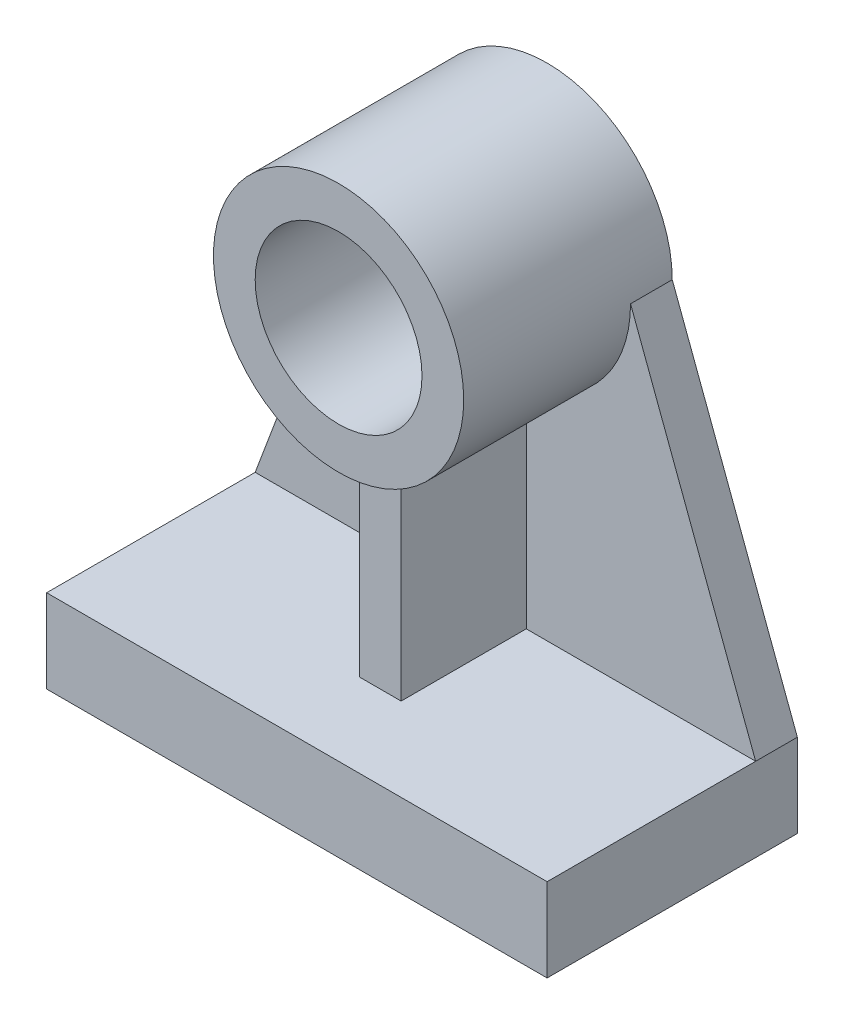
ISO-10303-21;
HEADER;
FILE_DESCRIPTION(('STEP AP214'),'2;1');
FILE_NAME('part.step','',(''),(''),'','','');
FILE_SCHEMA(('AUTOMOTIVE_DESIGN { 1 0 10303 214 1 1 1 1 }'));
ENDSEC;
DATA;
#1=APPLICATION_CONTEXT('core data for automotive mechanical design processes');
#2=APPLICATION_PROTOCOL_DEFINITION('international standard','automotive_design',2000,#1);
#3=PRODUCT_CONTEXT('',#1,'mechanical');
#4=PRODUCT('Part','Part','',(#3));
#5=PRODUCT_RELATED_PRODUCT_CATEGORY('part','',(#4));
#6=PRODUCT_DEFINITION_FORMATION('','',#4);
#7=PRODUCT_DEFINITION_CONTEXT('part definition',#1,'design');
#8=PRODUCT_DEFINITION('design','',#6,#7);
#9=PRODUCT_DEFINITION_SHAPE('','',#8);
#10=(LENGTH_UNIT() NAMED_UNIT(*) SI_UNIT(.MILLI.,.METRE.));
#11=(NAMED_UNIT(*) PLANE_ANGLE_UNIT() SI_UNIT($,.RADIAN.));
#12=(NAMED_UNIT(*) SI_UNIT($,.STERADIAN.) SOLID_ANGLE_UNIT());
#13=UNCERTAINTY_MEASURE_WITH_UNIT(LENGTH_MEASURE(1.E-05),#10,'distance_accuracy_value','');
#14=(GEOMETRIC_REPRESENTATION_CONTEXT(3) GLOBAL_UNCERTAINTY_ASSIGNED_CONTEXT((#13)) GLOBAL_UNIT_ASSIGNED_CONTEXT((#10,
#11,#12)) REPRESENTATION_CONTEXT('',''));
#15=CARTESIAN_POINT('',(0.,0.,0.));
#16=DIRECTION('',(0.,0.,1.));
#17=DIRECTION('',(1.,0.,0.));
#18=AXIS2_PLACEMENT_3D('',#15,#16,#17);
#19=CARTESIAN_POINT('',(0.,0.,127.));
#20=DIRECTION('',(0.,0.,-1.));
#21=DIRECTION('',(-1.,0.,0.));
#22=AXIS2_PLACEMENT_3D('',#19,#20,#21);
#23=CYLINDRICAL_SURFACE('',#22,76.2);
#24=CARTESIAN_POINT('',(0.,0.,127.));
#25=DIRECTION('',(0.,0.,1.));
#26=DIRECTION('',(1.,0.,0.));
#27=AXIS2_PLACEMENT_3D('',#24,#25,#26);
#28=CIRCLE('',#27,76.2);
#29=CARTESIAN_POINT('',(76.2,0.,127.));
#30=VERTEX_POINT('',#29);
#31=EDGE_CURVE('E11',#30,#30,#28,.T.);
#32=ORIENTED_EDGE('',*,*,#31,.F.);
#33=EDGE_LOOP('',(#32));
#34=FACE_BOUND('',#33,.T.);
#35=DIRECTION('',(0.,0.,-1.));
#36=VECTOR('',#35,1.);
#37=CARTESIAN_POINT('',(-76.2,0.,25.4));
#38=LINE('',#37,#36);
#39=CARTESIAN_POINT('',(-76.2,0.,25.4));
#40=VERTEX_POINT('',#39);
#41=CARTESIAN_POINT('',(-76.2,0.,0.));
#42=VERTEX_POINT('',#41);
#43=EDGE_CURVE('E136',#40,#42,#38,.T.);
#44=ORIENTED_EDGE('',*,*,#43,.F.);
#45=CARTESIAN_POINT('',(0.,0.,25.4));
#46=DIRECTION('',(0.,0.,1.));
#47=DIRECTION('',(1.,0.,0.));
#48=AXIS2_PLACEMENT_3D('',#45,#46,#47);
#49=CIRCLE('',#48,76.2);
#50=CARTESIAN_POINT('',(-12.7,-75.1342132453651,25.4));
#51=VERTEX_POINT('',#50);
#52=EDGE_CURVE('E144',#40,#51,#49,.T.);
#53=ORIENTED_EDGE('',*,*,#52,.T.);
#54=DIRECTION('',(0.,0.,-1.));
#55=VECTOR('',#54,1.);
#56=CARTESIAN_POINT('',(-12.7,-75.1342132453651,101.6));
#57=LINE('',#56,#55);
#58=CARTESIAN_POINT('',(-12.7,-75.1342132453651,101.6));
#59=VERTEX_POINT('',#58);
#60=EDGE_CURVE('E249',#59,#51,#57,.T.);
#61=ORIENTED_EDGE('',*,*,#60,.F.);
#62=CARTESIAN_POINT('',(0.,0.,101.6));
#63=DIRECTION('',(0.,0.,1.));
#64=DIRECTION('',(1.,0.,0.));
#65=AXIS2_PLACEMENT_3D('',#62,#63,#64);
#66=CIRCLE('',#65,76.2);
#67=CARTESIAN_POINT('',(12.7,-75.1342132453651,101.6));
#68=VERTEX_POINT('',#67);
#69=EDGE_CURVE('E224',#59,#68,#66,.T.);
#70=ORIENTED_EDGE('',*,*,#69,.T.);
#71=DIRECTION('',(0.,0.,-1.));
#72=VECTOR('',#71,1.);
#73=CARTESIAN_POINT('',(12.7,-75.1342132453651,101.6));
#74=LINE('',#73,#72);
#75=CARTESIAN_POINT('',(12.7,-75.1342132453651,25.4));
#76=VERTEX_POINT('',#75);
#77=EDGE_CURVE('E238',#68,#76,#74,.T.);
#78=ORIENTED_EDGE('',*,*,#77,.T.);
#79=CARTESIAN_POINT('',(0.,0.,25.4));
#80=DIRECTION('',(0.,0.,1.));
#81=DIRECTION('',(1.,0.,0.));
#82=AXIS2_PLACEMENT_3D('',#79,#80,#81);
#83=CIRCLE('',#82,76.2);
#84=CARTESIAN_POINT('',(76.2,0.,25.4));
#85=VERTEX_POINT('',#84);
#86=EDGE_CURVE('E65',#76,#85,#83,.T.);
#87=ORIENTED_EDGE('',*,*,#86,.T.);
#88=DIRECTION('',(0.,0.,-1.));
#89=VECTOR('',#88,1.);
#90=CARTESIAN_POINT('',(76.2,0.,25.4));
#91=LINE('',#90,#89);
#92=CARTESIAN_POINT('',(76.2,1.21430643318376E-13,0.));
#93=VERTEX_POINT('',#92);
#94=EDGE_CURVE('E69',#85,#93,#91,.T.);
#95=ORIENTED_EDGE('',*,*,#94,.T.);
#96=CARTESIAN_POINT('',(0.,0.,0.));
#97=DIRECTION('',(0.,0.,1.));
#98=DIRECTION('',(1.,0.,0.));
#99=AXIS2_PLACEMENT_3D('',#96,#97,#98);
#100=CIRCLE('',#99,76.2);
#101=EDGE_CURVE('E51',#93,#42,#100,.T.);
#102=ORIENTED_EDGE('',*,*,#101,.T.);
#103=EDGE_LOOP('',(#44,#53,#61,#70,#78,#87,#95,#102));
#104=FACE_BOUND('',#103,.T.);
#105=ADVANCED_FACE('F47',(#34,#104),#23,.T.);
#106=CARTESIAN_POINT('',(0.,0.,127.));
#107=DIRECTION('',(0.,0.,-1.));
#108=DIRECTION('',(-1.,0.,0.));
#109=AXIS2_PLACEMENT_3D('',#106,#107,#108);
#110=CYLINDRICAL_SURFACE('',#109,50.8);
#111=CARTESIAN_POINT('',(0.,0.,127.));
#112=DIRECTION('',(0.,0.,1.));
#113=DIRECTION('',(1.,0.,0.));
#114=AXIS2_PLACEMENT_3D('',#111,#112,#113);
#115=CIRCLE('',#114,50.8);
#116=CARTESIAN_POINT('',(50.8,0.,127.));
#117=VERTEX_POINT('',#116);
#118=EDGE_CURVE('E57',#117,#117,#115,.T.);
#119=ORIENTED_EDGE('',*,*,#118,.T.);
#120=EDGE_LOOP('',(#119));
#121=FACE_BOUND('',#120,.T.);
#122=CARTESIAN_POINT('',(0.,0.,0.));
#123=DIRECTION('',(0.,0.,1.));
#124=DIRECTION('',(1.,0.,0.));
#125=AXIS2_PLACEMENT_3D('',#122,#123,#124);
#126=CIRCLE('',#125,50.8);
#127=CARTESIAN_POINT('',(50.8,0.,0.));
#128=VERTEX_POINT('',#127);
#129=EDGE_CURVE('E252',#128,#128,#126,.T.);
#130=ORIENTED_EDGE('',*,*,#129,.F.);
#131=EDGE_LOOP('',(#130));
#132=FACE_BOUND('',#131,.T.);
#133=ADVANCED_FACE('F49',(#121,#132),#110,.F.);
#134=CARTESIAN_POINT('',(0.,0.,127.));
#135=DIRECTION('',(0.,0.,1.));
#136=DIRECTION('',(1.,0.,0.));
#137=AXIS2_PLACEMENT_3D('',#134,#135,#136);
#138=PLANE('',#137);
#139=ORIENTED_EDGE('',*,*,#118,.F.);
#140=EDGE_LOOP('',(#139));
#141=FACE_BOUND('',#140,.T.);
#142=ORIENTED_EDGE('',*,*,#31,.T.);
#143=EDGE_LOOP('',(#142));
#144=FACE_BOUND('',#143,.T.);
#145=ADVANCED_FACE('F263',(#141,#144),#138,.T.);
#146=CARTESIAN_POINT('',(0.,0.,0.));
#147=DIRECTION('',(0.,0.,1.));
#148=DIRECTION('',(1.,0.,0.));
#149=AXIS2_PLACEMENT_3D('',#146,#147,#148);
#150=PLANE('',#149);
#151=ORIENTED_EDGE('',*,*,#101,.F.);
#152=DIRECTION('',(0.351123441588392,-0.936329177569045,0.));
#153=VECTOR('',#152,1.);
#154=CARTESIAN_POINT('',(66.8054794520548,25.0520547945206,0.));
#155=LINE('',#154,#153);
#156=CARTESIAN_POINT('',(152.4,-203.2,0.));
#157=VERTEX_POINT('',#156);
#158=EDGE_CURVE('E168',#93,#157,#155,.T.);
#159=ORIENTED_EDGE('',*,*,#158,.T.);
#160=DIRECTION('',(0.,1.,0.));
#161=VECTOR('',#160,1.);
#162=CARTESIAN_POINT('',(152.4,0.,0.));
#163=LINE('',#162,#161);
#164=CARTESIAN_POINT('',(152.4,-254.,0.));
#165=VERTEX_POINT('',#164);
#166=EDGE_CURVE('E160',#165,#157,#163,.T.);
#167=ORIENTED_EDGE('',*,*,#166,.F.);
#168=DIRECTION('',(1.,0.,0.));
#169=VECTOR('',#168,1.);
#170=CARTESIAN_POINT('',(0.,-254.,0.));
#171=LINE('',#170,#169);
#172=CARTESIAN_POINT('',(-152.4,-254.,0.));
#173=VERTEX_POINT('',#172);
#174=EDGE_CURVE('E155',#173,#165,#171,.T.);
#175=ORIENTED_EDGE('',*,*,#174,.F.);
#176=DIRECTION('',(0.,1.,0.));
#177=VECTOR('',#176,1.);
#178=CARTESIAN_POINT('',(-152.4,0.,0.));
#179=LINE('',#178,#177);
#180=CARTESIAN_POINT('',(-152.4,-203.2,0.));
#181=VERTEX_POINT('',#180);
#182=EDGE_CURVE('E193',#173,#181,#179,.T.);
#183=ORIENTED_EDGE('',*,*,#182,.T.);
#184=DIRECTION('',(-0.351123441588392,-0.936329177569045,0.));
#185=VECTOR('',#184,1.);
#186=CARTESIAN_POINT('',(-66.8054794520548,25.0520547945206,0.));
#187=LINE('',#186,#185);
#188=EDGE_CURVE('E152',#42,#181,#187,.T.);
#189=ORIENTED_EDGE('',*,*,#188,.F.);
#190=EDGE_LOOP('',(#151,#159,#167,#175,#183,#189));
#191=FACE_BOUND('',#190,.T.);
#192=ORIENTED_EDGE('',*,*,#129,.T.);
#193=EDGE_LOOP('',(#192));
#194=FACE_BOUND('',#193,.T.);
#195=ADVANCED_FACE('F260',(#191,#194),#150,.F.);
#196=CARTESIAN_POINT('',(-12.7,0.,101.6));
#197=DIRECTION('',(-1.,0.,0.));
#198=DIRECTION('',(0.,0.,1.));
#199=AXIS2_PLACEMENT_3D('',#196,#197,#198);
#200=PLANE('',#199);
#201=DIRECTION('',(0.,1.,0.));
#202=VECTOR('',#201,1.);
#203=CARTESIAN_POINT('',(-12.7,0.,25.4));
#204=LINE('',#203,#202);
#205=CARTESIAN_POINT('',(-12.7,-203.2,25.4));
#206=VERTEX_POINT('',#205);
#207=EDGE_CURVE('E149',#206,#51,#204,.T.);
#208=ORIENTED_EDGE('',*,*,#207,.F.);
#209=DIRECTION('',(0.,0.,-1.));
#210=VECTOR('',#209,1.);
#211=CARTESIAN_POINT('',(-12.7,-203.2,101.6));
#212=LINE('',#211,#210);
#213=CARTESIAN_POINT('',(-12.7,-203.2,101.6));
#214=VERTEX_POINT('',#213);
#215=EDGE_CURVE('E245',#214,#206,#212,.T.);
#216=ORIENTED_EDGE('',*,*,#215,.F.);
#217=DIRECTION('',(0.,1.,0.));
#218=VECTOR('',#217,1.);
#219=CARTESIAN_POINT('',(-12.7,0.,101.6));
#220=LINE('',#219,#218);
#221=EDGE_CURVE('E227',#214,#59,#220,.T.);
#222=ORIENTED_EDGE('',*,*,#221,.T.);
#223=ORIENTED_EDGE('',*,*,#60,.T.);
#224=EDGE_LOOP('',(#208,#216,#222,#223));
#225=FACE_BOUND('',#224,.T.);
#226=ADVANCED_FACE('F280',(#225),#200,.T.);
#227=CARTESIAN_POINT('',(12.7,0.,101.6));
#228=DIRECTION('',(-1.,0.,0.));
#229=DIRECTION('',(0.,0.,1.));
#230=AXIS2_PLACEMENT_3D('',#227,#228,#229);
#231=PLANE('',#230);
#232=DIRECTION('',(0.,0.,-1.));
#233=VECTOR('',#232,1.);
#234=CARTESIAN_POINT('',(12.7,-203.2,101.6));
#235=LINE('',#234,#233);
#236=CARTESIAN_POINT('',(12.7,-203.2,101.6));
#237=VERTEX_POINT('',#236);
#238=CARTESIAN_POINT('',(12.7,-203.2,25.4));
#239=VERTEX_POINT('',#238);
#240=EDGE_CURVE('E241',#237,#239,#235,.T.);
#241=ORIENTED_EDGE('',*,*,#240,.T.);
#242=DIRECTION('',(0.,1.,0.));
#243=VECTOR('',#242,1.);
#244=CARTESIAN_POINT('',(12.7,0.,25.4));
#245=LINE('',#244,#243);
#246=EDGE_CURVE('E167',#239,#76,#245,.T.);
#247=ORIENTED_EDGE('',*,*,#246,.T.);
#248=ORIENTED_EDGE('',*,*,#77,.F.);
#249=DIRECTION('',(0.,1.,0.));
#250=VECTOR('',#249,1.);
#251=CARTESIAN_POINT('',(12.7,0.,101.6));
#252=LINE('',#251,#250);
#253=EDGE_CURVE('E234',#237,#68,#252,.T.);
#254=ORIENTED_EDGE('',*,*,#253,.F.);
#255=EDGE_LOOP('',(#241,#247,#248,#254));
#256=FACE_BOUND('',#255,.T.);
#257=ADVANCED_FACE('F285',(#256),#231,.F.);
#258=CARTESIAN_POINT('',(0.,0.,101.6));
#259=DIRECTION('',(0.,0.,1.));
#260=DIRECTION('',(1.,0.,0.));
#261=AXIS2_PLACEMENT_3D('',#258,#259,#260);
#262=PLANE('',#261);
#263=ORIENTED_EDGE('',*,*,#69,.F.);
#264=ORIENTED_EDGE('',*,*,#221,.F.);
#265=DIRECTION('',(1.,0.,0.));
#266=VECTOR('',#265,1.);
#267=CARTESIAN_POINT('',(0.,-203.2,101.6));
#268=LINE('',#267,#266);
#269=EDGE_CURVE('E231',#214,#237,#268,.T.);
#270=ORIENTED_EDGE('',*,*,#269,.T.);
#271=ORIENTED_EDGE('',*,*,#253,.T.);
#272=EDGE_LOOP('',(#263,#264,#270,#271));
#273=FACE_BOUND('',#272,.T.);
#274=ADVANCED_FACE('F289',(#273),#262,.T.);
#275=CARTESIAN_POINT('',(0.,-203.2,152.4));
#276=DIRECTION('',(0.,1.,0.));
#277=DIRECTION('',(0.,0.,1.));
#278=AXIS2_PLACEMENT_3D('',#275,#276,#277);
#279=PLANE('',#278);
#280=DIRECTION('',(1.,0.,0.));
#281=VECTOR('',#280,1.);
#282=CARTESIAN_POINT('',(0.,-203.2,25.4));
#283=LINE('',#282,#281);
#284=CARTESIAN_POINT('',(-152.4,-203.2,25.4));
#285=VERTEX_POINT('',#284);
#286=EDGE_CURVE('E143',#285,#206,#283,.T.);
#287=ORIENTED_EDGE('',*,*,#286,.F.);
#288=DIRECTION('',(0.,0.,-1.));
#289=VECTOR('',#288,1.);
#290=CARTESIAN_POINT('',(-152.4,-203.2,152.4));
#291=LINE('',#290,#289);
#292=CARTESIAN_POINT('',(-152.4,-203.2,152.4));
#293=VERTEX_POINT('',#292);
#294=EDGE_CURVE('E212',#293,#285,#291,.T.);
#295=ORIENTED_EDGE('',*,*,#294,.F.);
#296=DIRECTION('',(1.,0.,0.));
#297=VECTOR('',#296,1.);
#298=CARTESIAN_POINT('',(0.,-203.2,152.4));
#299=LINE('',#298,#297);
#300=CARTESIAN_POINT('',(152.4,-203.2,152.4));
#301=VERTEX_POINT('',#300);
#302=EDGE_CURVE('E196',#293,#301,#299,.T.);
#303=ORIENTED_EDGE('',*,*,#302,.T.);
#304=DIRECTION('',(0.,0.,-1.));
#305=VECTOR('',#304,1.);
#306=CARTESIAN_POINT('',(152.4,-203.2,152.4));
#307=LINE('',#306,#305);
#308=CARTESIAN_POINT('',(152.4,-203.2,25.4000000000001));
#309=VERTEX_POINT('',#308);
#310=EDGE_CURVE('E216',#301,#309,#307,.T.);
#311=ORIENTED_EDGE('',*,*,#310,.T.);
#312=DIRECTION('',(1.,0.,0.));
#313=VECTOR('',#312,1.);
#314=CARTESIAN_POINT('',(0.,-203.2,25.4));
#315=LINE('',#314,#313);
#316=EDGE_CURVE('E171',#239,#309,#315,.T.);
#317=ORIENTED_EDGE('',*,*,#316,.F.);
#318=ORIENTED_EDGE('',*,*,#240,.F.);
#319=ORIENTED_EDGE('',*,*,#269,.F.);
#320=ORIENTED_EDGE('',*,*,#215,.T.);
#321=EDGE_LOOP('',(#287,#295,#303,#311,#317,#318,#319,#320));
#322=FACE_BOUND('',#321,.T.);
#323=ADVANCED_FACE('F293',(#322),#279,.T.);
#324=CARTESIAN_POINT('',(0.,-254.,152.4));
#325=DIRECTION('',(0.,1.,0.));
#326=DIRECTION('',(0.,0.,1.));
#327=AXIS2_PLACEMENT_3D('',#324,#325,#326);
#328=PLANE('',#327);
#329=ORIENTED_EDGE('',*,*,#174,.T.);
#330=DIRECTION('',(0.,0.,-1.));
#331=VECTOR('',#330,1.);
#332=CARTESIAN_POINT('',(152.4,-254.,152.4));
#333=LINE('',#332,#331);
#334=CARTESIAN_POINT('',(152.4,-254.,152.4));
#335=VERTEX_POINT('',#334);
#336=EDGE_CURVE('E220',#335,#165,#333,.T.);
#337=ORIENTED_EDGE('',*,*,#336,.F.);
#338=DIRECTION('',(1.,0.,0.));
#339=VECTOR('',#338,1.);
#340=CARTESIAN_POINT('',(0.,-254.,152.4));
#341=LINE('',#340,#339);
#342=CARTESIAN_POINT('',(-152.4,-254.,152.4));
#343=VERTEX_POINT('',#342);
#344=EDGE_CURVE('E188',#343,#335,#341,.T.);
#345=ORIENTED_EDGE('',*,*,#344,.F.);
#346=DIRECTION('',(0.,0.,-1.));
#347=VECTOR('',#346,1.);
#348=CARTESIAN_POINT('',(-152.4,-254.,152.4));
#349=LINE('',#348,#347);
#350=EDGE_CURVE('E203',#343,#173,#349,.T.);
#351=ORIENTED_EDGE('',*,*,#350,.T.);
#352=EDGE_LOOP('',(#329,#337,#345,#351));
#353=FACE_BOUND('',#352,.T.);
#354=ADVANCED_FACE('F295',(#353),#328,.F.);
#355=CARTESIAN_POINT('',(152.4,0.,152.4));
#356=DIRECTION('',(-1.,0.,0.));
#357=DIRECTION('',(0.,0.,1.));
#358=AXIS2_PLACEMENT_3D('',#355,#356,#357);
#359=PLANE('',#358);
#360=ORIENTED_EDGE('',*,*,#166,.T.);
#361=DIRECTION('',(0.,0.,-1.));
#362=VECTOR('',#361,1.);
#363=CARTESIAN_POINT('',(152.4,-203.2,25.4));
#364=LINE('',#363,#362);
#365=EDGE_CURVE('E184',#309,#157,#364,.T.);
#366=ORIENTED_EDGE('',*,*,#365,.F.);
#367=ORIENTED_EDGE('',*,*,#310,.F.);
#368=DIRECTION('',(0.,1.,0.));
#369=VECTOR('',#368,1.);
#370=CARTESIAN_POINT('',(152.4,0.,152.4));
#371=LINE('',#370,#369);
#372=EDGE_CURVE('E192',#335,#301,#371,.T.);
#373=ORIENTED_EDGE('',*,*,#372,.F.);
#374=ORIENTED_EDGE('',*,*,#336,.T.);
#375=EDGE_LOOP('',(#360,#366,#367,#373,#374));
#376=FACE_BOUND('',#375,.T.);
#377=ADVANCED_FACE('F298',(#376),#359,.F.);
#378=CARTESIAN_POINT('',(-152.4,0.,152.4));
#379=DIRECTION('',(-1.,0.,0.));
#380=DIRECTION('',(0.,0.,1.));
#381=AXIS2_PLACEMENT_3D('',#378,#379,#380);
#382=PLANE('',#381);
#383=ORIENTED_EDGE('',*,*,#182,.F.);
#384=ORIENTED_EDGE('',*,*,#350,.F.);
#385=DIRECTION('',(0.,1.,0.));
#386=VECTOR('',#385,1.);
#387=CARTESIAN_POINT('',(-152.4,0.,152.4));
#388=LINE('',#387,#386);
#389=EDGE_CURVE('E200',#343,#293,#388,.T.);
#390=ORIENTED_EDGE('',*,*,#389,.T.);
#391=ORIENTED_EDGE('',*,*,#294,.T.);
#392=DIRECTION('',(0.,0.,-1.));
#393=VECTOR('',#392,1.);
#394=CARTESIAN_POINT('',(-152.4,-203.2,25.4));
#395=LINE('',#394,#393);
#396=EDGE_CURVE('E139',#285,#181,#395,.T.);
#397=ORIENTED_EDGE('',*,*,#396,.T.);
#398=EDGE_LOOP('',(#383,#384,#390,#391,#397));
#399=FACE_BOUND('',#398,.T.);
#400=ADVANCED_FACE('F302',(#399),#382,.T.);
#401=CARTESIAN_POINT('',(0.,0.,152.4));
#402=DIRECTION('',(0.,0.,1.));
#403=DIRECTION('',(1.,0.,0.));
#404=AXIS2_PLACEMENT_3D('',#401,#402,#403);
#405=PLANE('',#404);
#406=ORIENTED_EDGE('',*,*,#344,.T.);
#407=ORIENTED_EDGE('',*,*,#372,.T.);
#408=ORIENTED_EDGE('',*,*,#302,.F.);
#409=ORIENTED_EDGE('',*,*,#389,.F.);
#410=EDGE_LOOP('',(#406,#407,#408,#409));
#411=FACE_BOUND('',#410,.T.);
#412=ADVANCED_FACE('F309',(#411),#405,.T.);
#413=CARTESIAN_POINT('',(-66.8054794520548,25.0520547945206,25.4));
#414=DIRECTION('',(0.936329177569044,-0.351123441588392,0.));
#415=DIRECTION('',(0.351123441588392,0.936329177569045,0.));
#416=AXIS2_PLACEMENT_3D('',#413,#414,#415);
#417=PLANE('',#416);
#418=ORIENTED_EDGE('',*,*,#188,.T.);
#419=ORIENTED_EDGE('',*,*,#396,.F.);
#420=DIRECTION('',(-0.351123441588392,-0.936329177569045,0.));
#421=VECTOR('',#420,1.);
#422=CARTESIAN_POINT('',(-66.8054794520548,25.0520547945206,25.4));
#423=LINE('',#422,#421);
#424=EDGE_CURVE('E132',#40,#285,#423,.T.);
#425=ORIENTED_EDGE('',*,*,#424,.F.);
#426=ORIENTED_EDGE('',*,*,#43,.T.);
#427=EDGE_LOOP('',(#418,#419,#425,#426));
#428=FACE_BOUND('',#427,.T.);
#429=ADVANCED_FACE('F134',(#428),#417,.F.);
#430=CARTESIAN_POINT('',(0.,0.,25.4));
#431=DIRECTION('',(0.,0.,1.));
#432=DIRECTION('',(1.,0.,0.));
#433=AXIS2_PLACEMENT_3D('',#430,#431,#432);
#434=PLANE('',#433);
#435=ORIENTED_EDGE('',*,*,#52,.F.);
#436=ORIENTED_EDGE('',*,*,#424,.T.);
#437=ORIENTED_EDGE('',*,*,#286,.T.);
#438=ORIENTED_EDGE('',*,*,#207,.T.);
#439=EDGE_LOOP('',(#435,#436,#437,#438));
#440=FACE_BOUND('',#439,.T.);
#441=ADVANCED_FACE('F147',(#440),#434,.T.);
#442=CARTESIAN_POINT('',(66.8054794520548,25.0520547945206,25.4));
#443=DIRECTION('',(0.936329177569044,0.351123441588392,0.));
#444=DIRECTION('',(-0.351123441588392,0.936329177569045,0.));
#445=AXIS2_PLACEMENT_3D('',#442,#443,#444);
#446=PLANE('',#445);
#447=ORIENTED_EDGE('',*,*,#158,.F.);
#448=ORIENTED_EDGE('',*,*,#94,.F.);
#449=DIRECTION('',(0.351123441588392,-0.936329177569045,0.));
#450=VECTOR('',#449,1.);
#451=CARTESIAN_POINT('',(66.8054794520548,25.0520547945206,25.4));
#452=LINE('',#451,#450);
#453=EDGE_CURVE('E175',#85,#309,#452,.T.);
#454=ORIENTED_EDGE('',*,*,#453,.T.);
#455=ORIENTED_EDGE('',*,*,#365,.T.);
#456=EDGE_LOOP('',(#447,#448,#454,#455));
#457=FACE_BOUND('',#456,.T.);
#458=ADVANCED_FACE('F313',(#457),#446,.T.);
#459=CARTESIAN_POINT('',(0.,0.,25.4));
#460=DIRECTION('',(0.,0.,1.));
#461=DIRECTION('',(1.,0.,0.));
#462=AXIS2_PLACEMENT_3D('',#459,#460,#461);
#463=PLANE('',#462);
#464=ORIENTED_EDGE('',*,*,#86,.F.);
#465=ORIENTED_EDGE('',*,*,#246,.F.);
#466=ORIENTED_EDGE('',*,*,#316,.T.);
#467=ORIENTED_EDGE('',*,*,#453,.F.);
#468=EDGE_LOOP('',(#464,#465,#466,#467));
#469=FACE_BOUND('',#468,.T.);
#470=ADVANCED_FACE('F316',(#469),#463,.T.);
#471=CLOSED_SHELL('',(#105,#133,#145,#195,#226,#257,#274,#323,#354,#377,#400,#412,#429,#441,
#458,#470));
#472=MANIFOLD_SOLID_BREP('B2',#471);
#473=ADVANCED_BREP_SHAPE_REPRESENTATION('',(#18,#472),#14);
#474=SHAPE_DEFINITION_REPRESENTATION(#9,#473);
ENDSEC;
END-ISO-10303-21;
